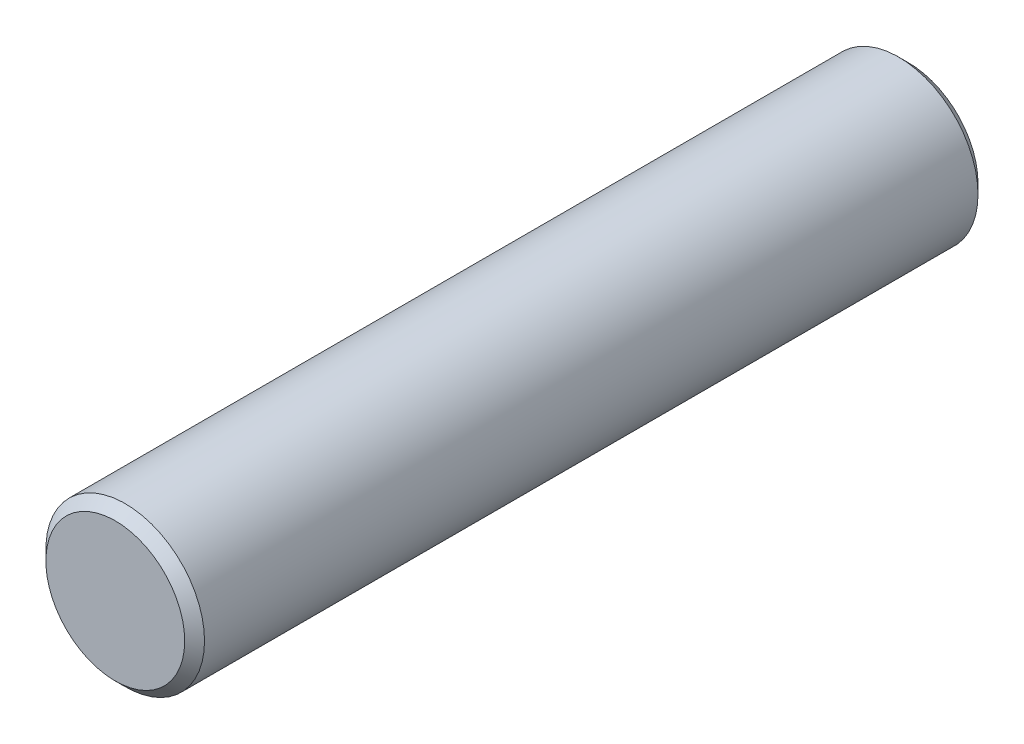
ISO-10303-21;
HEADER;
FILE_DESCRIPTION(('STEP AP214'),'2;1');
FILE_NAME('part.step','',(''),(''),'','','');
FILE_SCHEMA(('AUTOMOTIVE_DESIGN { 1 0 10303 214 1 1 1 1 }'));
ENDSEC;
DATA;
#1=APPLICATION_CONTEXT('core data for automotive mechanical design processes');
#2=APPLICATION_PROTOCOL_DEFINITION('international standard','automotive_design',2000,#1);
#3=PRODUCT_CONTEXT('',#1,'mechanical');
#4=PRODUCT('Part','Part','',(#3));
#5=PRODUCT_RELATED_PRODUCT_CATEGORY('part','',(#4));
#6=PRODUCT_DEFINITION_FORMATION('','',#4);
#7=PRODUCT_DEFINITION_CONTEXT('part definition',#1,'design');
#8=PRODUCT_DEFINITION('design','',#6,#7);
#9=PRODUCT_DEFINITION_SHAPE('','',#8);
#10=(LENGTH_UNIT() NAMED_UNIT(*) SI_UNIT(.MILLI.,.METRE.));
#11=(NAMED_UNIT(*) PLANE_ANGLE_UNIT() SI_UNIT($,.RADIAN.));
#12=(NAMED_UNIT(*) SI_UNIT($,.STERADIAN.) SOLID_ANGLE_UNIT());
#13=UNCERTAINTY_MEASURE_WITH_UNIT(LENGTH_MEASURE(1.E-05),#10,'distance_accuracy_value','');
#14=(GEOMETRIC_REPRESENTATION_CONTEXT(3) GLOBAL_UNCERTAINTY_ASSIGNED_CONTEXT((#13)) GLOBAL_UNIT_ASSIGNED_CONTEXT((#10,
#11,#12)) REPRESENTATION_CONTEXT('',''));
#15=CARTESIAN_POINT('',(0.,0.,0.));
#16=DIRECTION('',(0.,0.,1.));
#17=DIRECTION('',(1.,0.,0.));
#18=AXIS2_PLACEMENT_3D('',#15,#16,#17);
#19=CARTESIAN_POINT('',(0.,0.,20.));
#20=DIRECTION('',(0.,0.,-1.));
#21=DIRECTION('',(-1.,0.,0.));
#22=AXIS2_PLACEMENT_3D('',#19,#20,#21);
#23=CYLINDRICAL_SURFACE('',#22,2.);
#24=CARTESIAN_POINT('',(0.,0.,0.250000000000004));
#25=DIRECTION('',(0.,0.,1.));
#26=DIRECTION('',(1.,0.,0.));
#27=AXIS2_PLACEMENT_3D('',#24,#25,#26);
#28=CIRCLE('',#27,2.);
#29=CARTESIAN_POINT('',(2.,0.,0.250000000000004));
#30=VERTEX_POINT('',#29);
#31=EDGE_CURVE('E42',#30,#30,#28,.T.);
#32=ORIENTED_EDGE('',*,*,#31,.T.);
#33=EDGE_LOOP('',(#32));
#34=FACE_BOUND('',#33,.T.);
#35=CARTESIAN_POINT('',(0.,0.,19.75));
#36=DIRECTION('',(0.,0.,1.));
#37=DIRECTION('',(1.,0.,0.));
#38=AXIS2_PLACEMENT_3D('',#35,#36,#37);
#39=CIRCLE('',#38,2.);
#40=CARTESIAN_POINT('',(2.,0.,19.75));
#41=VERTEX_POINT('',#40);
#42=EDGE_CURVE('E46',#41,#41,#39,.F.);
#43=ORIENTED_EDGE('',*,*,#42,.T.);
#44=EDGE_LOOP('',(#43));
#45=FACE_BOUND('',#44,.T.);
#46=ADVANCED_FACE('F31',(#34,#45),#23,.T.);
#47=CARTESIAN_POINT('',(0.,0.,20.));
#48=DIRECTION('',(0.,0.,1.));
#49=DIRECTION('',(1.,0.,0.));
#50=AXIS2_PLACEMENT_3D('',#47,#48,#49);
#51=PLANE('',#50);
#52=CARTESIAN_POINT('',(0.,0.,20.));
#53=DIRECTION('',(0.,0.,1.));
#54=DIRECTION('',(1.,0.,0.));
#55=AXIS2_PLACEMENT_3D('',#52,#53,#54);
#56=CIRCLE('',#55,1.75);
#57=CARTESIAN_POINT('',(1.75,0.,20.));
#58=VERTEX_POINT('',#57);
#59=EDGE_CURVE('E10',#58,#58,#56,.T.);
#60=ORIENTED_EDGE('',*,*,#59,.T.);
#61=EDGE_LOOP('',(#60));
#62=FACE_BOUND('',#61,.T.);
#63=ADVANCED_FACE('F62',(#62),#51,.T.);
#64=CARTESIAN_POINT('',(0.,0.,0.));
#65=DIRECTION('',(0.,0.,1.));
#66=DIRECTION('',(1.,0.,0.));
#67=AXIS2_PLACEMENT_3D('',#64,#65,#66);
#68=PLANE('',#67);
#69=CARTESIAN_POINT('',(0.,0.,0.));
#70=DIRECTION('',(0.,0.,1.));
#71=DIRECTION('',(1.,0.,0.));
#72=AXIS2_PLACEMENT_3D('',#69,#70,#71);
#73=CIRCLE('',#72,1.75);
#74=CARTESIAN_POINT('',(1.75,0.,0.));
#75=VERTEX_POINT('',#74);
#76=EDGE_CURVE('E38',#75,#75,#73,.F.);
#77=ORIENTED_EDGE('',*,*,#76,.T.);
#78=EDGE_LOOP('',(#77));
#79=FACE_BOUND('',#78,.T.);
#80=ADVANCED_FACE('F59',(#79),#68,.F.);
#81=CARTESIAN_POINT('',(0.,0.,0.250000000000004));
#82=DIRECTION('',(0.,0.,1.));
#83=DIRECTION('',(1.,0.,0.));
#84=AXIS2_PLACEMENT_3D('',#81,#82,#83);
#85=CONICAL_SURFACE('',#84,2.,0.785398163397445);
#86=ORIENTED_EDGE('',*,*,#76,.F.);
#87=EDGE_LOOP('',(#86));
#88=FACE_BOUND('',#87,.T.);
#89=ORIENTED_EDGE('',*,*,#31,.F.);
#90=EDGE_LOOP('',(#89));
#91=FACE_BOUND('',#90,.T.);
#92=ADVANCED_FACE('F55',(#88,#91),#85,.T.);
#93=CARTESIAN_POINT('',(0.,0.,20.));
#94=DIRECTION('',(0.,0.,-1.));
#95=DIRECTION('',(-1.,0.,0.));
#96=AXIS2_PLACEMENT_3D('',#93,#94,#95);
#97=CONICAL_SURFACE('',#96,1.75,0.785398163397459);
#98=ORIENTED_EDGE('',*,*,#42,.F.);
#99=EDGE_LOOP('',(#98));
#100=FACE_BOUND('',#99,.T.);
#101=ORIENTED_EDGE('',*,*,#59,.F.);
#102=EDGE_LOOP('',(#101));
#103=FACE_BOUND('',#102,.T.);
#104=ADVANCED_FACE('F33',(#100,#103),#97,.T.);
#105=CLOSED_SHELL('',(#46,#63,#80,#92,#104));
#106=MANIFOLD_SOLID_BREP('B2',#105);
#107=ADVANCED_BREP_SHAPE_REPRESENTATION('',(#18,#106),#14);
#108=SHAPE_DEFINITION_REPRESENTATION(#9,#107);
ENDSEC;
END-ISO-10303-21;
